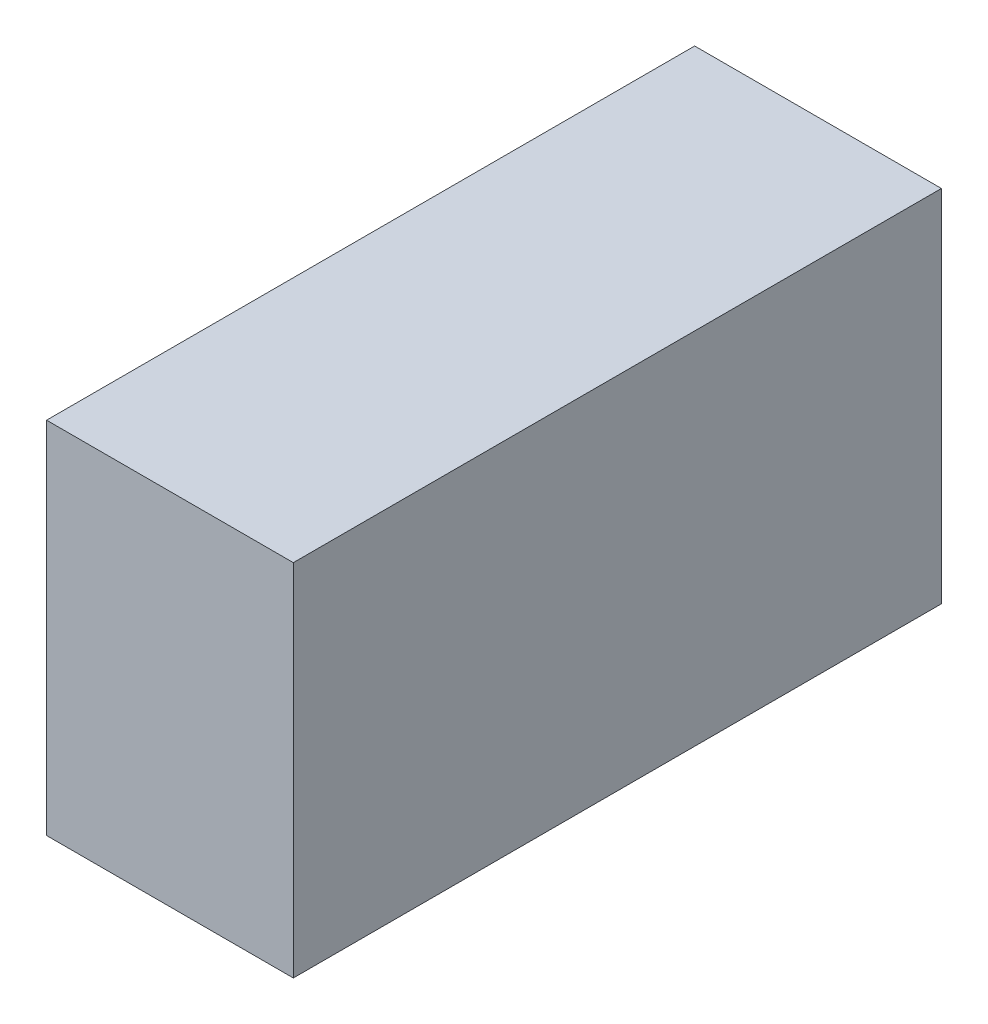
ISO-10303-21;
HEADER;
FILE_DESCRIPTION(('STEP AP214'),'2;1');
FILE_NAME('part.step','',(''),(''),'','','');
FILE_SCHEMA(('AUTOMOTIVE_DESIGN { 1 0 10303 214 1 1 1 1 }'));
ENDSEC;
DATA;
#1=APPLICATION_CONTEXT('core data for automotive mechanical design processes');
#2=APPLICATION_PROTOCOL_DEFINITION('international standard','automotive_design',2000,#1);
#3=PRODUCT_CONTEXT('',#1,'mechanical');
#4=PRODUCT('Part','Part','',(#3));
#5=PRODUCT_RELATED_PRODUCT_CATEGORY('part','',(#4));
#6=PRODUCT_DEFINITION_FORMATION('','',#4);
#7=PRODUCT_DEFINITION_CONTEXT('part definition',#1,'design');
#8=PRODUCT_DEFINITION('design','',#6,#7);
#9=PRODUCT_DEFINITION_SHAPE('','',#8);
#10=(LENGTH_UNIT() NAMED_UNIT(*) SI_UNIT(.MILLI.,.METRE.));
#11=(NAMED_UNIT(*) PLANE_ANGLE_UNIT() SI_UNIT($,.RADIAN.));
#12=(NAMED_UNIT(*) SI_UNIT($,.STERADIAN.) SOLID_ANGLE_UNIT());
#13=UNCERTAINTY_MEASURE_WITH_UNIT(LENGTH_MEASURE(1.E-05),#10,'distance_accuracy_value','');
#14=(GEOMETRIC_REPRESENTATION_CONTEXT(3) GLOBAL_UNCERTAINTY_ASSIGNED_CONTEXT((#13)) GLOBAL_UNIT_ASSIGNED_CONTEXT((#10,
#11,#12)) REPRESENTATION_CONTEXT('',''));
#15=CARTESIAN_POINT('',(0.,0.,0.));
#16=DIRECTION('',(0.,0.,1.));
#17=DIRECTION('',(1.,0.,0.));
#18=AXIS2_PLACEMENT_3D('',#15,#16,#17);
#19=CARTESIAN_POINT('',(-36.5112989632292,43.9893085079122,218.));
#20=DIRECTION('',(1.,0.,0.));
#21=DIRECTION('',(0.,1.,0.));
#22=AXIS2_PLACEMENT_3D('',#19,#20,#21);
#23=PLANE('',#22);
#24=DIRECTION('',(0.,-1.,0.));
#25=VECTOR('',#24,1.);
#26=CARTESIAN_POINT('',(-36.5112989632292,43.9893085079122,0.));
#27=LINE('',#26,#25);
#28=CARTESIAN_POINT('',(-36.5112989632292,43.9893085079122,0.));
#29=VERTEX_POINT('',#28);
#30=CARTESIAN_POINT('',(-36.5112989632292,-77.0106914920878,0.));
#31=VERTEX_POINT('',#30);
#32=EDGE_CURVE('E107',#29,#31,#27,.T.);
#33=ORIENTED_EDGE('',*,*,#32,.T.);
#34=DIRECTION('',(0.,0.,-1.));
#35=VECTOR('',#34,1.);
#36=CARTESIAN_POINT('',(-36.5112989632292,-77.0106914920878,218.));
#37=LINE('',#36,#35);
#38=CARTESIAN_POINT('',(-36.5112989632292,-77.0106914920878,218.));
#39=VERTEX_POINT('',#38);
#40=EDGE_CURVE('E11',#39,#31,#37,.T.);
#41=ORIENTED_EDGE('',*,*,#40,.F.);
#42=DIRECTION('',(0.,-1.,0.));
#43=VECTOR('',#42,1.);
#44=CARTESIAN_POINT('',(-36.5112989632292,43.9893085079122,218.));
#45=LINE('',#44,#43);
#46=CARTESIAN_POINT('',(-36.5112989632292,43.9893085079122,218.));
#47=VERTEX_POINT('',#46);
#48=EDGE_CURVE('E91',#47,#39,#45,.T.);
#49=ORIENTED_EDGE('',*,*,#48,.F.);
#50=DIRECTION('',(0.,0.,-1.));
#51=VECTOR('',#50,1.);
#52=CARTESIAN_POINT('',(-36.5112989632292,43.9893085079122,218.));
#53=LINE('',#52,#51);
#54=EDGE_CURVE('E103',#47,#29,#53,.T.);
#55=ORIENTED_EDGE('',*,*,#54,.T.);
#56=EDGE_LOOP('',(#33,#41,#49,#55));
#57=FACE_BOUND('',#56,.T.);
#58=ADVANCED_FACE('F39',(#57),#23,.F.);
#59=CARTESIAN_POINT('',(-36.5112989632292,-77.0106914920878,218.));
#60=DIRECTION('',(0.,1.,0.));
#61=DIRECTION('',(0.,0.,1.));
#62=AXIS2_PLACEMENT_3D('',#59,#60,#61);
#63=PLANE('',#62);
#64=DIRECTION('',(1.,0.,0.));
#65=VECTOR('',#64,1.);
#66=CARTESIAN_POINT('',(-36.5112989632292,-77.0106914920878,0.));
#67=LINE('',#66,#65);
#68=CARTESIAN_POINT('',(46.4887010367708,-77.0106914920878,0.));
#69=VERTEX_POINT('',#68);
#70=EDGE_CURVE('E96',#31,#69,#67,.T.);
#71=ORIENTED_EDGE('',*,*,#70,.T.);
#72=DIRECTION('',(0.,0.,-1.));
#73=VECTOR('',#72,1.);
#74=CARTESIAN_POINT('',(46.4887010367708,-77.0106914920878,218.));
#75=LINE('',#74,#73);
#76=CARTESIAN_POINT('',(46.4887010367708,-77.0106914920878,218.));
#77=VERTEX_POINT('',#76);
#78=EDGE_CURVE('E48',#77,#69,#75,.T.);
#79=ORIENTED_EDGE('',*,*,#78,.F.);
#80=DIRECTION('',(1.,0.,0.));
#81=VECTOR('',#80,1.);
#82=CARTESIAN_POINT('',(-36.5112989632292,-77.0106914920878,218.));
#83=LINE('',#82,#81);
#84=EDGE_CURVE('E86',#39,#77,#83,.T.);
#85=ORIENTED_EDGE('',*,*,#84,.F.);
#86=ORIENTED_EDGE('',*,*,#40,.T.);
#87=EDGE_LOOP('',(#71,#79,#85,#86));
#88=FACE_BOUND('',#87,.T.);
#89=ADVANCED_FACE('F95',(#88),#63,.F.);
#90=CARTESIAN_POINT('',(46.4887010367708,43.9893085079122,218.));
#91=DIRECTION('',(-1.,0.,0.));
#92=DIRECTION('',(0.,-1.,0.));
#93=AXIS2_PLACEMENT_3D('',#90,#91,#92);
#94=PLANE('',#93);
#95=DIRECTION('',(0.,1.,0.));
#96=VECTOR('',#95,1.);
#97=CARTESIAN_POINT('',(46.4887010367708,43.9893085079122,0.));
#98=LINE('',#97,#96);
#99=CARTESIAN_POINT('',(46.4887010367708,43.9893085079122,0.));
#100=VERTEX_POINT('',#99);
#101=EDGE_CURVE('E73',#69,#100,#98,.T.);
#102=ORIENTED_EDGE('',*,*,#101,.T.);
#103=DIRECTION('',(0.,0.,-1.));
#104=VECTOR('',#103,1.);
#105=CARTESIAN_POINT('',(46.4887010367708,43.9893085079122,218.));
#106=LINE('',#105,#104);
#107=CARTESIAN_POINT('',(46.4887010367708,43.9893085079122,218.));
#108=VERTEX_POINT('',#107);
#109=EDGE_CURVE('E98',#108,#100,#106,.T.);
#110=ORIENTED_EDGE('',*,*,#109,.F.);
#111=DIRECTION('',(0.,1.,0.));
#112=VECTOR('',#111,1.);
#113=CARTESIAN_POINT('',(46.4887010367708,43.9893085079122,218.));
#114=LINE('',#113,#112);
#115=EDGE_CURVE('E89',#77,#108,#114,.T.);
#116=ORIENTED_EDGE('',*,*,#115,.F.);
#117=ORIENTED_EDGE('',*,*,#78,.T.);
#118=EDGE_LOOP('',(#102,#110,#116,#117));
#119=FACE_BOUND('',#118,.T.);
#120=ADVANCED_FACE('F99',(#119),#94,.F.);
#121=CARTESIAN_POINT('',(-36.5112989632292,43.9893085079122,218.));
#122=DIRECTION('',(0.,-1.,0.));
#123=DIRECTION('',(0.,0.,-1.));
#124=AXIS2_PLACEMENT_3D('',#121,#122,#123);
#125=PLANE('',#124);
#126=DIRECTION('',(-1.,0.,0.));
#127=VECTOR('',#126,1.);
#128=CARTESIAN_POINT('',(-36.5112989632292,43.9893085079122,0.));
#129=LINE('',#128,#127);
#130=EDGE_CURVE('E79',#100,#29,#129,.T.);
#131=ORIENTED_EDGE('',*,*,#130,.T.);
#132=ORIENTED_EDGE('',*,*,#54,.F.);
#133=DIRECTION('',(-1.,0.,0.));
#134=VECTOR('',#133,1.);
#135=CARTESIAN_POINT('',(-36.5112989632292,43.9893085079122,218.));
#136=LINE('',#135,#134);
#137=EDGE_CURVE('E56',#108,#47,#136,.T.);
#138=ORIENTED_EDGE('',*,*,#137,.F.);
#139=ORIENTED_EDGE('',*,*,#109,.T.);
#140=EDGE_LOOP('',(#131,#132,#138,#139));
#141=FACE_BOUND('',#140,.T.);
#142=ADVANCED_FACE('F120',(#141),#125,.F.);
#143=CARTESIAN_POINT('',(0.,0.,218.));
#144=DIRECTION('',(0.,0.,1.));
#145=DIRECTION('',(1.,0.,0.));
#146=AXIS2_PLACEMENT_3D('',#143,#144,#145);
#147=PLANE('',#146);
#148=ORIENTED_EDGE('',*,*,#48,.T.);
#149=ORIENTED_EDGE('',*,*,#84,.T.);
#150=ORIENTED_EDGE('',*,*,#115,.T.);
#151=ORIENTED_EDGE('',*,*,#137,.T.);
#152=EDGE_LOOP('',(#148,#149,#150,#151));
#153=FACE_BOUND('',#152,.T.);
#154=ADVANCED_FACE('F87',(#153),#147,.T.);
#155=CARTESIAN_POINT('',(0.,0.,0.));
#156=DIRECTION('',(0.,0.,1.));
#157=DIRECTION('',(1.,0.,0.));
#158=AXIS2_PLACEMENT_3D('',#155,#156,#157);
#159=PLANE('',#158);
#160=ORIENTED_EDGE('',*,*,#32,.F.);
#161=ORIENTED_EDGE('',*,*,#130,.F.);
#162=ORIENTED_EDGE('',*,*,#101,.F.);
#163=ORIENTED_EDGE('',*,*,#70,.F.);
#164=EDGE_LOOP('',(#160,#161,#162,#163));
#165=FACE_BOUND('',#164,.T.);
#166=ADVANCED_FACE('F123',(#165),#159,.F.);
#167=CLOSED_SHELL('',(#58,#89,#120,#142,#154,#166));
#168=MANIFOLD_SOLID_BREP('B2',#167);
#169=ADVANCED_BREP_SHAPE_REPRESENTATION('',(#18,#168),#14);
#170=SHAPE_DEFINITION_REPRESENTATION(#9,#169);
ENDSEC;
END-ISO-10303-21;
